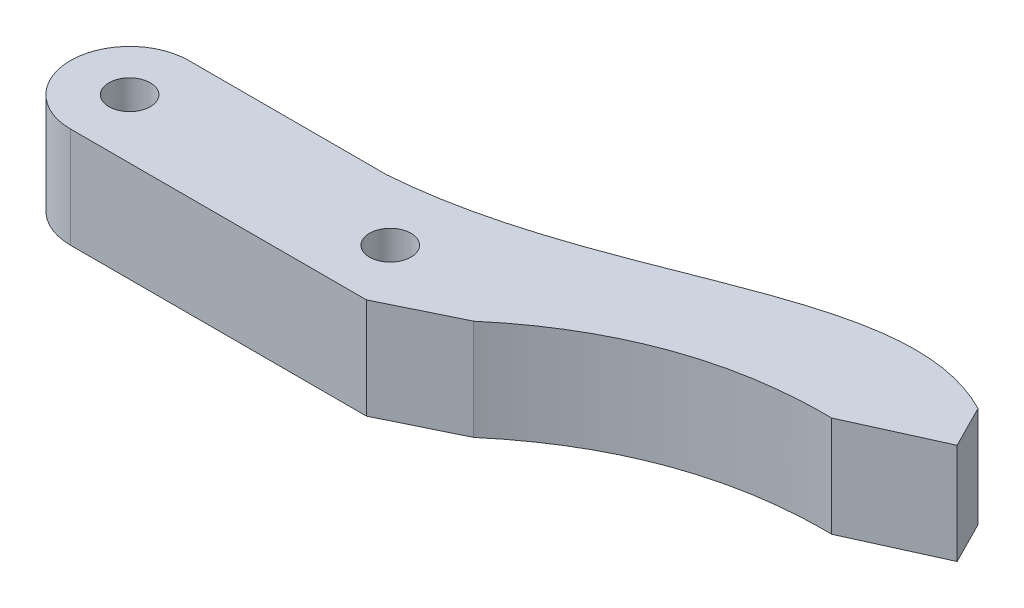
ISO-10303-21;
HEADER;
FILE_DESCRIPTION(('STEP AP214'),'2;1');
FILE_NAME('part.step','',(''),(''),'','','');
FILE_SCHEMA(('AUTOMOTIVE_DESIGN { 1 0 10303 214 1 1 1 1 }'));
ENDSEC;
DATA;
#1=APPLICATION_CONTEXT('core data for automotive mechanical design processes');
#2=APPLICATION_PROTOCOL_DEFINITION('international standard','automotive_design',2000,#1);
#3=PRODUCT_CONTEXT('',#1,'mechanical');
#4=PRODUCT('Part','Part','',(#3));
#5=PRODUCT_RELATED_PRODUCT_CATEGORY('part','',(#4));
#6=PRODUCT_DEFINITION_FORMATION('','',#4);
#7=PRODUCT_DEFINITION_CONTEXT('part definition',#1,'design');
#8=PRODUCT_DEFINITION('design','',#6,#7);
#9=PRODUCT_DEFINITION_SHAPE('','',#8);
#10=(LENGTH_UNIT() NAMED_UNIT(*) SI_UNIT(.MILLI.,.METRE.));
#11=(NAMED_UNIT(*) PLANE_ANGLE_UNIT() SI_UNIT($,.RADIAN.));
#12=(NAMED_UNIT(*) SI_UNIT($,.STERADIAN.) SOLID_ANGLE_UNIT());
#13=UNCERTAINTY_MEASURE_WITH_UNIT(LENGTH_MEASURE(1.E-05),#10,'distance_accuracy_value','');
#14=(GEOMETRIC_REPRESENTATION_CONTEXT(3) GLOBAL_UNCERTAINTY_ASSIGNED_CONTEXT((#13)) GLOBAL_UNIT_ASSIGNED_CONTEXT((#10,
#11,#12)) REPRESENTATION_CONTEXT('',''));
#15=CARTESIAN_POINT('',(0.,0.,0.));
#16=DIRECTION('',(0.,0.,1.));
#17=DIRECTION('',(1.,0.,0.));
#18=AXIS2_PLACEMENT_3D('',#15,#16,#17);
#19=CARTESIAN_POINT('',(0.,8.5,-5.));
#20=DIRECTION('',(0.,0.,-1.));
#21=DIRECTION('',(-1.,0.,0.));
#22=AXIS2_PLACEMENT_3D('',#19,#20,#21);
#23=PLANE('',#22);
#24=DIRECTION('',(1.,0.,0.));
#25=VECTOR('',#24,1.);
#26=CARTESIAN_POINT('',(0.,8.5,-5.));
#27=LINE('',#26,#25);
#28=CARTESIAN_POINT('',(0.,8.5,-5.));
#29=VERTEX_POINT('',#28);
#30=CARTESIAN_POINT('',(16.6939503632034,8.5,-5.));
#31=VERTEX_POINT('',#30);
#32=EDGE_CURVE('E221',#29,#31,#27,.T.);
#33=ORIENTED_EDGE('',*,*,#32,.T.);
#34=DIRECTION('',(0.,1.,0.));
#35=VECTOR('',#34,1.);
#36=CARTESIAN_POINT('',(16.6939503632034,0.,-5.));
#37=LINE('',#36,#35);
#38=CARTESIAN_POINT('',(16.6939503632034,0.,-5.));
#39=VERTEX_POINT('',#38);
#40=EDGE_CURVE('E137',#39,#31,#37,.T.);
#41=ORIENTED_EDGE('',*,*,#40,.F.);
#42=DIRECTION('',(1.,0.,0.));
#43=VECTOR('',#42,1.);
#44=CARTESIAN_POINT('',(0.,0.,-5.));
#45=LINE('',#44,#43);
#46=CARTESIAN_POINT('',(0.,0.,-5.));
#47=VERTEX_POINT('',#46);
#48=EDGE_CURVE('E124',#47,#39,#45,.T.);
#49=ORIENTED_EDGE('',*,*,#48,.F.);
#50=DIRECTION('',(0.,-1.,0.));
#51=VECTOR('',#50,1.);
#52=CARTESIAN_POINT('',(0.,8.5,-5.));
#53=LINE('',#52,#51);
#54=EDGE_CURVE('E51',#29,#47,#53,.T.);
#55=ORIENTED_EDGE('',*,*,#54,.F.);
#56=EDGE_LOOP('',(#33,#41,#49,#55));
#57=FACE_BOUND('',#56,.T.);
#58=ADVANCED_FACE('F41',(#57),#23,.T.);
#59=CARTESIAN_POINT('',(0.,8.5,0.));
#60=DIRECTION('',(0.,-1.,0.));
#61=DIRECTION('',(0.,0.,-1.));
#62=AXIS2_PLACEMENT_3D('',#59,#60,#61);
#63=CYLINDRICAL_SURFACE('',#62,5.);
#64=CARTESIAN_POINT('',(0.,0.,0.));
#65=DIRECTION('',(0.,1.,0.));
#66=DIRECTION('',(0.,0.,1.));
#67=AXIS2_PLACEMENT_3D('',#64,#65,#66);
#68=CIRCLE('',#67,5.);
#69=CARTESIAN_POINT('',(0.,0.,5.));
#70=VERTEX_POINT('',#69);
#71=EDGE_CURVE('E231',#47,#70,#68,.T.);
#72=ORIENTED_EDGE('',*,*,#71,.T.);
#73=DIRECTION('',(0.,-1.,0.));
#74=VECTOR('',#73,1.);
#75=CARTESIAN_POINT('',(0.,8.5,5.));
#76=LINE('',#75,#74);
#77=CARTESIAN_POINT('',(0.,8.5,5.));
#78=VERTEX_POINT('',#77);
#79=EDGE_CURVE('E11',#78,#70,#76,.T.);
#80=ORIENTED_EDGE('',*,*,#79,.F.);
#81=CARTESIAN_POINT('',(0.,8.5,0.));
#82=DIRECTION('',(0.,1.,0.));
#83=DIRECTION('',(0.,0.,1.));
#84=AXIS2_PLACEMENT_3D('',#81,#82,#83);
#85=CIRCLE('',#84,5.);
#86=EDGE_CURVE('E215',#29,#78,#85,.T.);
#87=ORIENTED_EDGE('',*,*,#86,.F.);
#88=ORIENTED_EDGE('',*,*,#54,.T.);
#89=EDGE_LOOP('',(#72,#80,#87,#88));
#90=FACE_BOUND('',#89,.T.);
#91=ADVANCED_FACE('F243',(#90),#63,.T.);
#92=CARTESIAN_POINT('',(0.,8.5,5.));
#93=DIRECTION('',(0.,0.,-1.));
#94=DIRECTION('',(-1.,0.,0.));
#95=AXIS2_PLACEMENT_3D('',#92,#93,#94);
#96=PLANE('',#95);
#97=DIRECTION('',(1.,0.,0.));
#98=VECTOR('',#97,1.);
#99=CARTESIAN_POINT('',(0.,0.,5.));
#100=LINE('',#99,#98);
#101=CARTESIAN_POINT('',(24.99,0.,5.));
#102=VERTEX_POINT('',#101);
#103=EDGE_CURVE('E70',#70,#102,#100,.T.);
#104=ORIENTED_EDGE('',*,*,#103,.T.);
#105=DIRECTION('',(0.,1.,0.));
#106=VECTOR('',#105,1.);
#107=CARTESIAN_POINT('',(24.99,0.,5.));
#108=LINE('',#107,#106);
#109=CARTESIAN_POINT('',(24.99,8.5,5.));
#110=VERTEX_POINT('',#109);
#111=EDGE_CURVE('E195',#102,#110,#108,.T.);
#112=ORIENTED_EDGE('',*,*,#111,.T.);
#113=DIRECTION('',(1.,0.,0.));
#114=VECTOR('',#113,1.);
#115=CARTESIAN_POINT('',(0.,8.5,5.));
#116=LINE('',#115,#114);
#117=EDGE_CURVE('E101',#78,#110,#116,.T.);
#118=ORIENTED_EDGE('',*,*,#117,.F.);
#119=ORIENTED_EDGE('',*,*,#79,.T.);
#120=EDGE_LOOP('',(#104,#112,#118,#119));
#121=FACE_BOUND('',#120,.T.);
#122=ADVANCED_FACE('F262',(#121),#96,.F.);
#123=CARTESIAN_POINT('',(0.,8.5,0.));
#124=DIRECTION('',(0.,-1.,0.));
#125=DIRECTION('',(0.,0.,-1.));
#126=AXIS2_PLACEMENT_3D('',#123,#124,#125);
#127=CYLINDRICAL_SURFACE('',#126,1.75);
#128=CARTESIAN_POINT('',(0.,8.5,0.));
#129=DIRECTION('',(0.,1.,0.));
#130=DIRECTION('',(0.,0.,1.));
#131=AXIS2_PLACEMENT_3D('',#128,#129,#130);
#132=CIRCLE('',#131,1.75);
#133=CARTESIAN_POINT('',(0.,8.5,1.75));
#134=VERTEX_POINT('',#133);
#135=EDGE_CURVE('E211',#134,#134,#132,.T.);
#136=ORIENTED_EDGE('',*,*,#135,.T.);
#137=EDGE_LOOP('',(#136));
#138=FACE_BOUND('',#137,.T.);
#139=CARTESIAN_POINT('',(0.,0.,0.));
#140=DIRECTION('',(0.,1.,0.));
#141=DIRECTION('',(0.,0.,1.));
#142=AXIS2_PLACEMENT_3D('',#139,#140,#141);
#143=CIRCLE('',#142,1.75);
#144=CARTESIAN_POINT('',(0.,0.,1.75));
#145=VERTEX_POINT('',#144);
#146=EDGE_CURVE('E201',#145,#145,#143,.T.);
#147=ORIENTED_EDGE('',*,*,#146,.F.);
#148=EDGE_LOOP('',(#147));
#149=FACE_BOUND('',#148,.T.);
#150=ADVANCED_FACE('F43',(#138,#149),#127,.F.);
#151=CARTESIAN_POINT('',(22.,8.5,0.));
#152=DIRECTION('',(0.,-1.,0.));
#153=DIRECTION('',(0.,0.,-1.));
#154=AXIS2_PLACEMENT_3D('',#151,#152,#153);
#155=CYLINDRICAL_SURFACE('',#154,1.75);
#156=CARTESIAN_POINT('',(22.,8.5,0.));
#157=DIRECTION('',(0.,1.,0.));
#158=DIRECTION('',(0.,0.,1.));
#159=AXIS2_PLACEMENT_3D('',#156,#157,#158);
#160=CIRCLE('',#159,1.75);
#161=CARTESIAN_POINT('',(22.,8.5,1.75));
#162=VERTEX_POINT('',#161);
#163=EDGE_CURVE('E224',#162,#162,#160,.T.);
#164=ORIENTED_EDGE('',*,*,#163,.T.);
#165=EDGE_LOOP('',(#164));
#166=FACE_BOUND('',#165,.T.);
#167=CARTESIAN_POINT('',(22.,0.,0.));
#168=DIRECTION('',(0.,1.,0.));
#169=DIRECTION('',(0.,0.,1.));
#170=AXIS2_PLACEMENT_3D('',#167,#168,#169);
#171=CIRCLE('',#170,1.75);
#172=CARTESIAN_POINT('',(22.,0.,1.75));
#173=VERTEX_POINT('',#172);
#174=EDGE_CURVE('E216',#173,#173,#171,.T.);
#175=ORIENTED_EDGE('',*,*,#174,.F.);
#176=EDGE_LOOP('',(#175));
#177=FACE_BOUND('',#176,.T.);
#178=ADVANCED_FACE('F269',(#166,#177),#155,.F.);
#179=CARTESIAN_POINT('',(0.,8.5,0.));
#180=DIRECTION('',(0.,1.,0.));
#181=DIRECTION('',(0.,0.,1.));
#182=AXIS2_PLACEMENT_3D('',#179,#180,#181);
#183=PLANE('',#182);
#184=ORIENTED_EDGE('',*,*,#135,.F.);
#185=EDGE_LOOP('',(#184));
#186=FACE_BOUND('',#185,.T.);
#187=ORIENTED_EDGE('',*,*,#86,.T.);
#188=ORIENTED_EDGE('',*,*,#117,.T.);
#189=DIRECTION('',(0.898794046299166,0.,-0.438371146789079));
#190=VECTOR('',#189,1.);
#191=CARTESIAN_POINT('',(6.77233674982273,8.5,13.8853480546302));
#192=LINE('',#191,#190);
#193=CARTESIAN_POINT('',(31.08,8.5,2.0297085356339));
#194=VERTEX_POINT('',#193);
#195=EDGE_CURVE('E154',#110,#194,#192,.T.);
#196=ORIENTED_EDGE('',*,*,#195,.T.);
#197=CARTESIAN_POINT('',(31.08,8.5,2.0297085356339));
#198=CARTESIAN_POINT('',(40.7387234524963,8.5,-6.18827081402431));
#199=CARTESIAN_POINT('',(53.27,8.5,-6.));
#200=B_SPLINE_CURVE_WITH_KNOTS('',2,(#197,#198,#199),.UNSPECIFIED.,.F.,.F.,(3,3),(0.,1.),.UNSPECIFIED.);
#201=CARTESIAN_POINT('',(53.27,8.5,-6.));
#202=VERTEX_POINT('',#201);
#203=EDGE_CURVE('E252',#194,#202,#200,.T.);
#204=ORIENTED_EDGE('',*,*,#203,.T.);
#205=DIRECTION('',(-0.910876713981416,0.,0.41267858186053));
#206=VECTOR('',#205,1.);
#207=CARTESIAN_POINT('',(6.81667754386652,8.5,15.0459779459223));
#208=LINE('',#207,#206);
#209=CARTESIAN_POINT('',(60.5570137118513,8.5,-9.30142865488424));
#210=VERTEX_POINT('',#209);
#211=EDGE_CURVE('E189',#210,#202,#208,.T.);
#212=ORIENTED_EDGE('',*,*,#211,.F.);
#213=DIRECTION('',(0.451753427962833,0.,0.892142836278939));
#214=VECTOR('',#213,1.);
#215=CARTESIAN_POINT('',(51.9472097518166,8.5,-26.3044538656701));
#216=LINE('',#215,#214);
#217=CARTESIAN_POINT('',(58.75,8.5,-12.87));
#218=VERTEX_POINT('',#217);
#219=EDGE_CURVE('E186',#218,#210,#216,.T.);
#220=ORIENTED_EDGE('',*,*,#219,.F.);
#221=CARTESIAN_POINT('',(11.,8.5,-5.));
#222=CARTESIAN_POINT('',(31.616493670577,8.5,-3.43755514648909));
#223=CARTESIAN_POINT('',(45.7055676046875,8.5,-19.6384278561026));
#224=CARTESIAN_POINT('',(58.75,8.5,-12.87));
#225=B_SPLINE_CURVE_WITH_KNOTS('',3,(#221,#222,#223,#224),.UNSPECIFIED.,.F.,.F.,(4,4),(0.,1.),.UNSPECIFIED.);
#226=EDGE_CURVE('E133',#31,#218,#225,.T.);
#227=ORIENTED_EDGE('',*,*,#226,.F.);
#228=ORIENTED_EDGE('',*,*,#32,.F.);
#229=EDGE_LOOP('',(#187,#188,#196,#204,#212,#220,#227,#228));
#230=FACE_BOUND('',#229,.T.);
#231=ORIENTED_EDGE('',*,*,#163,.F.);
#232=EDGE_LOOP('',(#231));
#233=FACE_BOUND('',#232,.T.);
#234=ADVANCED_FACE('F246',(#186,#230,#233),#183,.T.);
#235=CARTESIAN_POINT('',(0.,0.,0.));
#236=DIRECTION('',(0.,1.,0.));
#237=DIRECTION('',(0.,0.,1.));
#238=AXIS2_PLACEMENT_3D('',#235,#236,#237);
#239=PLANE('',#238);
#240=ORIENTED_EDGE('',*,*,#146,.T.);
#241=EDGE_LOOP('',(#240));
#242=FACE_BOUND('',#241,.T.);
#243=ORIENTED_EDGE('',*,*,#71,.F.);
#244=ORIENTED_EDGE('',*,*,#48,.T.);
#245=CARTESIAN_POINT('',(11.,0.,-5.));
#246=CARTESIAN_POINT('',(31.616493670577,0.,-3.43755514648909));
#247=CARTESIAN_POINT('',(45.7055676046875,0.,-19.6384278561026));
#248=CARTESIAN_POINT('',(58.75,0.,-12.87));
#249=B_SPLINE_CURVE_WITH_KNOTS('',3,(#245,#246,#247,#248),.UNSPECIFIED.,.F.,.F.,(4,4),(0.,1.),.UNSPECIFIED.);
#250=CARTESIAN_POINT('',(58.75,0.,-12.87));
#251=VERTEX_POINT('',#250);
#252=EDGE_CURVE('E117',#39,#251,#249,.T.);
#253=ORIENTED_EDGE('',*,*,#252,.T.);
#254=DIRECTION('',(0.451753427962833,0.,0.892142836278939));
#255=VECTOR('',#254,1.);
#256=CARTESIAN_POINT('',(51.9472097518166,0.,-26.3044538656701));
#257=LINE('',#256,#255);
#258=CARTESIAN_POINT('',(60.5570137118513,0.,-9.30142865488424));
#259=VERTEX_POINT('',#258);
#260=EDGE_CURVE('E122',#251,#259,#257,.T.);
#261=ORIENTED_EDGE('',*,*,#260,.T.);
#262=DIRECTION('',(-0.910876713981416,0.,0.41267858186053));
#263=VECTOR('',#262,1.);
#264=CARTESIAN_POINT('',(6.81667754386652,0.,15.0459779459223));
#265=LINE('',#264,#263);
#266=CARTESIAN_POINT('',(53.27,0.,-6.));
#267=VERTEX_POINT('',#266);
#268=EDGE_CURVE('E144',#259,#267,#265,.T.);
#269=ORIENTED_EDGE('',*,*,#268,.T.);
#270=CARTESIAN_POINT('',(31.08,0.,2.0297085356339));
#271=CARTESIAN_POINT('',(40.7387234524963,0.,-6.18827081402431));
#272=CARTESIAN_POINT('',(53.27,0.,-6.));
#273=B_SPLINE_CURVE_WITH_KNOTS('',2,(#270,#271,#272),.UNSPECIFIED.,.F.,.F.,(3,3),(0.,1.),.UNSPECIFIED.);
#274=CARTESIAN_POINT('',(31.08,0.,2.0297085356339));
#275=VERTEX_POINT('',#274);
#276=EDGE_CURVE('E147',#275,#267,#273,.T.);
#277=ORIENTED_EDGE('',*,*,#276,.F.);
#278=DIRECTION('',(0.898794046299166,0.,-0.438371146789079));
#279=VECTOR('',#278,1.);
#280=CARTESIAN_POINT('',(6.77233674982273,0.,13.8853480546302));
#281=LINE('',#280,#279);
#282=EDGE_CURVE('E178',#102,#275,#281,.T.);
#283=ORIENTED_EDGE('',*,*,#282,.F.);
#284=ORIENTED_EDGE('',*,*,#103,.F.);
#285=EDGE_LOOP('',(#243,#244,#253,#261,#269,#277,#283,#284));
#286=FACE_BOUND('',#285,.T.);
#287=ORIENTED_EDGE('',*,*,#174,.T.);
#288=EDGE_LOOP('',(#287));
#289=FACE_BOUND('',#288,.T.);
#290=ADVANCED_FACE('F119',(#242,#286,#289),#239,.F.);
#291=CARTESIAN_POINT('',(6.77233674982273,0.,13.8853480546302));
#292=DIRECTION('',(0.438371146789079,0.,0.898794046299166));
#293=DIRECTION('',(0.898794046299166,0.,-0.438371146789079));
#294=AXIS2_PLACEMENT_3D('',#291,#292,#293);
#295=PLANE('',#294);
#296=ORIENTED_EDGE('',*,*,#195,.F.);
#297=ORIENTED_EDGE('',*,*,#111,.F.);
#298=ORIENTED_EDGE('',*,*,#282,.T.);
#299=DIRECTION('',(0.,1.,0.));
#300=VECTOR('',#299,1.);
#301=CARTESIAN_POINT('',(31.08,0.,2.0297085356339));
#302=LINE('',#301,#300);
#303=EDGE_CURVE('E108',#275,#194,#302,.T.);
#304=ORIENTED_EDGE('',*,*,#303,.T.);
#305=EDGE_LOOP('',(#296,#297,#298,#304));
#306=FACE_BOUND('',#305,.T.);
#307=ADVANCED_FACE('F162',(#306),#295,.T.);
#308=DIRECTION('',(0.,1.,0.));
#309=VECTOR('',#308,1.);
#310=SURFACE_OF_LINEAR_EXTRUSION('',#249,#309);
#311=ORIENTED_EDGE('',*,*,#226,.T.);
#312=DIRECTION('',(0.,1.,0.));
#313=VECTOR('',#312,1.);
#314=CARTESIAN_POINT('',(58.75,0.,-12.87));
#315=LINE('',#314,#313);
#316=EDGE_CURVE('E130',#251,#218,#315,.T.);
#317=ORIENTED_EDGE('',*,*,#316,.F.);
#318=ORIENTED_EDGE('',*,*,#252,.F.);
#319=ORIENTED_EDGE('',*,*,#40,.T.);
#320=EDGE_LOOP('',(#311,#317,#318,#319));
#321=FACE_BOUND('',#320,.T.);
#322=ADVANCED_FACE('F131',(#321),#310,.F.);
#323=CARTESIAN_POINT('',(51.9472097518166,0.,-26.3044538656701));
#324=DIRECTION('',(-0.892142836278939,0.,0.451753427962832));
#325=DIRECTION('',(0.451753427962833,0.,0.892142836278939));
#326=AXIS2_PLACEMENT_3D('',#323,#324,#325);
#327=PLANE('',#326);
#328=ORIENTED_EDGE('',*,*,#219,.T.);
#329=DIRECTION('',(0.,1.,0.));
#330=VECTOR('',#329,1.);
#331=CARTESIAN_POINT('',(60.5570137118513,0.,-9.30142865488424));
#332=LINE('',#331,#330);
#333=EDGE_CURVE('E138',#259,#210,#332,.T.);
#334=ORIENTED_EDGE('',*,*,#333,.F.);
#335=ORIENTED_EDGE('',*,*,#260,.F.);
#336=ORIENTED_EDGE('',*,*,#316,.T.);
#337=EDGE_LOOP('',(#328,#334,#335,#336));
#338=FACE_BOUND('',#337,.T.);
#339=ADVANCED_FACE('F140',(#338),#327,.F.);
#340=CARTESIAN_POINT('',(6.81667754386652,0.,15.0459779459223));
#341=DIRECTION('',(-0.41267858186053,0.,-0.910876713981416));
#342=DIRECTION('',(-0.910876713981416,0.,0.41267858186053));
#343=AXIS2_PLACEMENT_3D('',#340,#341,#342);
#344=PLANE('',#343);
#345=ORIENTED_EDGE('',*,*,#211,.T.);
#346=DIRECTION('',(0.,1.,0.));
#347=VECTOR('',#346,1.);
#348=CARTESIAN_POINT('',(53.27,0.,-6.));
#349=LINE('',#348,#347);
#350=EDGE_CURVE('E206',#267,#202,#349,.T.);
#351=ORIENTED_EDGE('',*,*,#350,.F.);
#352=ORIENTED_EDGE('',*,*,#268,.F.);
#353=ORIENTED_EDGE('',*,*,#333,.T.);
#354=EDGE_LOOP('',(#345,#351,#352,#353));
#355=FACE_BOUND('',#354,.T.);
#356=ADVANCED_FACE('F165',(#355),#344,.F.);
#357=DIRECTION('',(0.,1.,0.));
#358=VECTOR('',#357,1.);
#359=SURFACE_OF_LINEAR_EXTRUSION('',#273,#358);
#360=ORIENTED_EDGE('',*,*,#203,.F.);
#361=ORIENTED_EDGE('',*,*,#303,.F.);
#362=ORIENTED_EDGE('',*,*,#276,.T.);
#363=ORIENTED_EDGE('',*,*,#350,.T.);
#364=EDGE_LOOP('',(#360,#361,#362,#363));
#365=FACE_BOUND('',#364,.T.);
#366=ADVANCED_FACE('F168',(#365),#359,.T.);
#367=CLOSED_SHELL('',(#58,#91,#122,#150,#178,#234,#290,#307,#322,#339,#356,#366));
#368=MANIFOLD_SOLID_BREP('B2',#367);
#369=ADVANCED_BREP_SHAPE_REPRESENTATION('',(#18,#368),#14);
#370=SHAPE_DEFINITION_REPRESENTATION(#9,#369);
ENDSEC;
END-ISO-10303-21;
